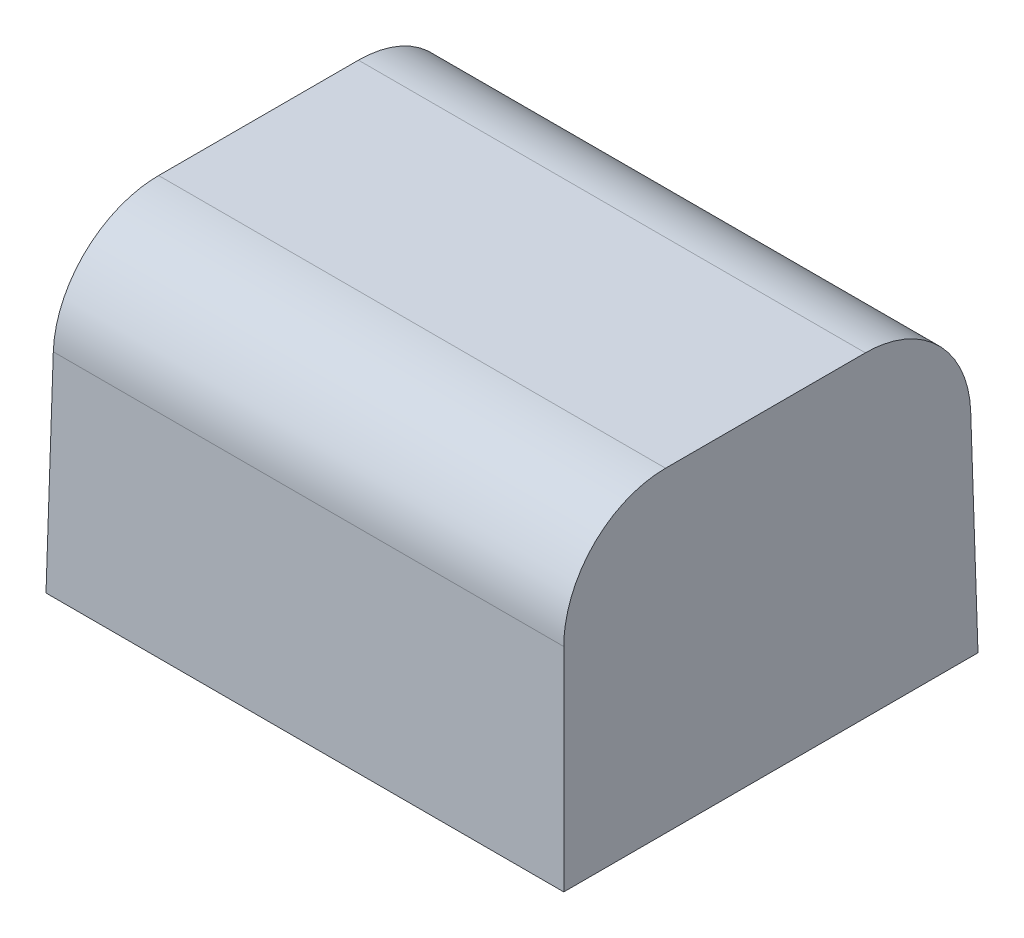
ISO-10303-21;
HEADER;
FILE_DESCRIPTION(('STEP AP214'),'2;1');
FILE_NAME('part.step','',(''),(''),'','','');
FILE_SCHEMA(('AUTOMOTIVE_DESIGN { 1 0 10303 214 1 1 1 1 }'));
ENDSEC;
DATA;
#1=APPLICATION_CONTEXT('core data for automotive mechanical design processes');
#2=APPLICATION_PROTOCOL_DEFINITION('international standard','automotive_design',2000,#1);
#3=PRODUCT_CONTEXT('',#1,'mechanical');
#4=PRODUCT('Part','Part','',(#3));
#5=PRODUCT_RELATED_PRODUCT_CATEGORY('part','',(#4));
#6=PRODUCT_DEFINITION_FORMATION('','',#4);
#7=PRODUCT_DEFINITION_CONTEXT('part definition',#1,'design');
#8=PRODUCT_DEFINITION('design','',#6,#7);
#9=PRODUCT_DEFINITION_SHAPE('','',#8);
#10=(LENGTH_UNIT() NAMED_UNIT(*) SI_UNIT(.MILLI.,.METRE.));
#11=(NAMED_UNIT(*) PLANE_ANGLE_UNIT() SI_UNIT($,.RADIAN.));
#12=(NAMED_UNIT(*) SI_UNIT($,.STERADIAN.) SOLID_ANGLE_UNIT());
#13=UNCERTAINTY_MEASURE_WITH_UNIT(LENGTH_MEASURE(1.E-05),#10,'distance_accuracy_value','');
#14=(GEOMETRIC_REPRESENTATION_CONTEXT(3) GLOBAL_UNCERTAINTY_ASSIGNED_CONTEXT((#13)) GLOBAL_UNIT_ASSIGNED_CONTEXT((#10,
#11,#12)) REPRESENTATION_CONTEXT('',''));
#15=CARTESIAN_POINT('',(0.,0.,0.));
#16=DIRECTION('',(0.,0.,1.));
#17=DIRECTION('',(1.,0.,0.));
#18=AXIS2_PLACEMENT_3D('',#15,#16,#17);
#19=CARTESIAN_POINT('',(0.,0.,-40.));
#20=DIRECTION('',(-0.999847695156391,0.0174524064372835,0.));
#21=DIRECTION('',(-0.0174524064372835,-0.999847695156391,0.));
#22=AXIS2_PLACEMENT_3D('',#19,#20,#21);
#23=PLANE('',#22);
#24=DIRECTION('',(0.,0.,-1.));
#25=VECTOR('',#24,1.);
#26=CARTESIAN_POINT('',(0.523651947846529,30.,-40.));
#27=LINE('',#26,#25);
#28=CARTESIAN_POINT('',(0.523651947846529,30.,-29.6493754209966));
#29=VERTEX_POINT('',#28);
#30=CARTESIAN_POINT('',(0.523651947846529,30.,-10.3506245790034));
#31=VERTEX_POINT('',#30);
#32=EDGE_CURVE('E130',#29,#31,#27,.F.);
#33=ORIENTED_EDGE('',*,*,#32,.F.);
#34=CARTESIAN_POINT('',(0.349101298564352,20.,-29.6493754209966));
#35=DIRECTION('',(-0.999847695156391,0.0174524064372835,0.));
#36=DIRECTION('',(-0.0174524064372835,-0.999847695156391,0.));
#37=AXIS2_PLACEMENT_3D('',#34,#35,#36);
#38=ELLIPSE('',#37,10.0015232804391,10.);
#39=CARTESIAN_POINT('',(0.352147627439517,20.1745240643728,-39.6478523725605));
#40=VERTEX_POINT('',#39);
#41=EDGE_CURVE('E156',#29,#40,#38,.T.);
#42=ORIENTED_EDGE('',*,*,#41,.T.);
#43=DIRECTION('',(-0.0174497491606827,-0.999695459881887,-0.0174497491606827));
#44=VECTOR('',#43,1.);
#45=CARTESIAN_POINT('',(0.,0.,-40.));
#46=LINE('',#45,#44);
#47=CARTESIAN_POINT('',(0.,0.,-40.));
#48=VERTEX_POINT('',#47);
#49=EDGE_CURVE('E121',#40,#48,#46,.T.);
#50=ORIENTED_EDGE('',*,*,#49,.T.);
#51=DIRECTION('',(0.,0.,1.));
#52=VECTOR('',#51,1.);
#53=CARTESIAN_POINT('',(0.,0.,-40.));
#54=LINE('',#53,#52);
#55=CARTESIAN_POINT('',(0.,0.,0.));
#56=VERTEX_POINT('',#55);
#57=EDGE_CURVE('E115',#48,#56,#54,.T.);
#58=ORIENTED_EDGE('',*,*,#57,.T.);
#59=DIRECTION('',(-0.0174497491606827,-0.999695459881887,0.0174497491606827));
#60=VECTOR('',#59,1.);
#61=CARTESIAN_POINT('',(0.,0.,0.));
#62=LINE('',#61,#60);
#63=CARTESIAN_POINT('',(0.352147627439517,20.1745240643728,-0.352147627439517));
#64=VERTEX_POINT('',#63);
#65=EDGE_CURVE('E98',#64,#56,#62,.T.);
#66=ORIENTED_EDGE('',*,*,#65,.F.);
#67=CARTESIAN_POINT('',(0.349101298564352,20.,-10.3506245790034));
#68=DIRECTION('',(-0.999847695156391,0.0174524064372835,0.));
#69=DIRECTION('',(0.0174524064372835,0.999847695156391,0.));
#70=AXIS2_PLACEMENT_3D('',#67,#68,#69);
#71=ELLIPSE('',#70,10.0015232804391,10.);
#72=EDGE_CURVE('E153',#64,#31,#71,.T.);
#73=ORIENTED_EDGE('',*,*,#72,.T.);
#74=EDGE_LOOP('',(#33,#42,#50,#58,#66,#73));
#75=FACE_BOUND('',#74,.T.);
#76=ADVANCED_FACE('F44',(#75),#23,.T.);
#77=CARTESIAN_POINT('',(0.,0.,0.));
#78=DIRECTION('',(0.,0.0174524064372835,0.999847695156391));
#79=DIRECTION('',(0.,-0.999847695156391,0.0174524064372835));
#80=AXIS2_PLACEMENT_3D('',#77,#78,#79);
#81=PLANE('',#80);
#82=DIRECTION('',(0.0174497491606827,-0.999695459881887,0.0174497491606827));
#83=VECTOR('',#82,1.);
#84=CARTESIAN_POINT('',(50.,0.,0.));
#85=LINE('',#84,#83);
#86=CARTESIAN_POINT('',(49.6478523725605,20.1745240643728,-0.352147627439517));
#87=VERTEX_POINT('',#86);
#88=CARTESIAN_POINT('',(50.,0.,0.));
#89=VERTEX_POINT('',#88);
#90=EDGE_CURVE('E109',#87,#89,#85,.T.);
#91=ORIENTED_EDGE('',*,*,#90,.F.);
#92=DIRECTION('',(1.,0.,0.));
#93=VECTOR('',#92,1.);
#94=CARTESIAN_POINT('',(0.523651947846529,20.1745240643728,-0.352147627439517));
#95=LINE('',#94,#93);
#96=EDGE_CURVE('E11',#87,#64,#95,.F.);
#97=ORIENTED_EDGE('',*,*,#96,.T.);
#98=ORIENTED_EDGE('',*,*,#65,.T.);
#99=DIRECTION('',(1.,0.,0.));
#100=VECTOR('',#99,1.);
#101=CARTESIAN_POINT('',(0.,0.,0.));
#102=LINE('',#101,#100);
#103=EDGE_CURVE('E101',#56,#89,#102,.T.);
#104=ORIENTED_EDGE('',*,*,#103,.T.);
#105=EDGE_LOOP('',(#91,#97,#98,#104));
#106=FACE_BOUND('',#105,.T.);
#107=ADVANCED_FACE('F100',(#106),#81,.T.);
#108=CARTESIAN_POINT('',(50.,0.,0.));
#109=DIRECTION('',(0.999847695156391,0.0174524064372835,0.));
#110=DIRECTION('',(-0.0174524064372835,0.999847695156391,0.));
#111=AXIS2_PLACEMENT_3D('',#108,#109,#110);
#112=PLANE('',#111);
#113=DIRECTION('',(0.0174497491606827,-0.999695459881887,-0.0174497491606827));
#114=VECTOR('',#113,1.);
#115=CARTESIAN_POINT('',(50.,0.,-40.));
#116=LINE('',#115,#114);
#117=CARTESIAN_POINT('',(49.6478523725605,20.1745240643728,-39.6478523725605));
#118=VERTEX_POINT('',#117);
#119=CARTESIAN_POINT('',(50.,0.,-40.));
#120=VERTEX_POINT('',#119);
#121=EDGE_CURVE('E134',#118,#120,#116,.T.);
#122=ORIENTED_EDGE('',*,*,#121,.F.);
#123=CARTESIAN_POINT('',(49.6508987014357,20.,-29.6493754209966));
#124=DIRECTION('',(0.999847695156391,0.0174524064372835,0.));
#125=DIRECTION('',(-0.0174524064372835,0.999847695156391,0.));
#126=AXIS2_PLACEMENT_3D('',#123,#124,#125);
#127=ELLIPSE('',#126,10.0015232804391,10.);
#128=CARTESIAN_POINT('',(49.4763480521535,30.,-29.6493754209966));
#129=VERTEX_POINT('',#128);
#130=EDGE_CURVE('E53',#118,#129,#127,.T.);
#131=ORIENTED_EDGE('',*,*,#130,.T.);
#132=DIRECTION('',(0.,0.,1.));
#133=VECTOR('',#132,1.);
#134=CARTESIAN_POINT('',(49.4763480521535,30.,0.));
#135=LINE('',#134,#133);
#136=CARTESIAN_POINT('',(49.4763480521535,30.,-10.3506245790034));
#137=VERTEX_POINT('',#136);
#138=EDGE_CURVE('E135',#137,#129,#135,.F.);
#139=ORIENTED_EDGE('',*,*,#138,.F.);
#140=CARTESIAN_POINT('',(49.6508987014357,20.,-10.3506245790034));
#141=DIRECTION('',(0.999847695156391,0.0174524064372835,0.));
#142=DIRECTION('',(0.0174524064372835,-0.999847695156391,0.));
#143=AXIS2_PLACEMENT_3D('',#140,#141,#142);
#144=ELLIPSE('',#143,10.0015232804391,10.);
#145=EDGE_CURVE('E60',#137,#87,#144,.T.);
#146=ORIENTED_EDGE('',*,*,#145,.T.);
#147=ORIENTED_EDGE('',*,*,#90,.T.);
#148=DIRECTION('',(0.,0.,-1.));
#149=VECTOR('',#148,1.);
#150=CARTESIAN_POINT('',(50.,0.,0.));
#151=LINE('',#150,#149);
#152=EDGE_CURVE('E117',#89,#120,#151,.T.);
#153=ORIENTED_EDGE('',*,*,#152,.T.);
#154=EDGE_LOOP('',(#122,#131,#139,#146,#147,#153));
#155=FACE_BOUND('',#154,.T.);
#156=ADVANCED_FACE('F164',(#155),#112,.T.);
#157=CARTESIAN_POINT('',(50.,0.,-40.));
#158=DIRECTION('',(0.,0.0174524064372835,-0.999847695156391));
#159=DIRECTION('',(0.,0.999847695156391,0.0174524064372835));
#160=AXIS2_PLACEMENT_3D('',#157,#158,#159);
#161=PLANE('',#160);
#162=ORIENTED_EDGE('',*,*,#49,.F.);
#163=DIRECTION('',(-1.,0.,0.));
#164=VECTOR('',#163,1.);
#165=CARTESIAN_POINT('',(49.4763480521535,20.1745240643728,-39.6478523725605));
#166=LINE('',#165,#164);
#167=EDGE_CURVE('E68',#40,#118,#166,.F.);
#168=ORIENTED_EDGE('',*,*,#167,.T.);
#169=ORIENTED_EDGE('',*,*,#121,.T.);
#170=DIRECTION('',(-1.,0.,0.));
#171=VECTOR('',#170,1.);
#172=CARTESIAN_POINT('',(50.,0.,-40.));
#173=LINE('',#172,#171);
#174=EDGE_CURVE('E128',#120,#48,#173,.T.);
#175=ORIENTED_EDGE('',*,*,#174,.T.);
#176=EDGE_LOOP('',(#162,#168,#169,#175));
#177=FACE_BOUND('',#176,.T.);
#178=ADVANCED_FACE('F171',(#177),#161,.T.);
#179=CARTESIAN_POINT('',(0.,30.,0.));
#180=DIRECTION('',(0.,1.,0.));
#181=DIRECTION('',(0.,0.,1.));
#182=AXIS2_PLACEMENT_3D('',#179,#180,#181);
#183=PLANE('',#182);
#184=ORIENTED_EDGE('',*,*,#138,.T.);
#185=DIRECTION('',(1.,0.,0.));
#186=VECTOR('',#185,1.);
#187=CARTESIAN_POINT('',(0.52365194784653,30.,-29.6493754209966));
#188=LINE('',#187,#186);
#189=EDGE_CURVE('E149',#129,#29,#188,.F.);
#190=ORIENTED_EDGE('',*,*,#189,.T.);
#191=ORIENTED_EDGE('',*,*,#32,.T.);
#192=DIRECTION('',(-1.,0.,0.));
#193=VECTOR('',#192,1.);
#194=CARTESIAN_POINT('',(49.4763480521535,30.,-10.3506245790034));
#195=LINE('',#194,#193);
#196=EDGE_CURVE('E108',#31,#137,#195,.F.);
#197=ORIENTED_EDGE('',*,*,#196,.T.);
#198=EDGE_LOOP('',(#184,#190,#191,#197));
#199=FACE_BOUND('',#198,.T.);
#200=ADVANCED_FACE('F168',(#199),#183,.T.);
#201=CARTESIAN_POINT('',(0.,0.,0.));
#202=DIRECTION('',(0.,1.,0.));
#203=DIRECTION('',(0.,0.,1.));
#204=AXIS2_PLACEMENT_3D('',#201,#202,#203);
#205=PLANE('',#204);
#206=ORIENTED_EDGE('',*,*,#57,.F.);
#207=ORIENTED_EDGE('',*,*,#174,.F.);
#208=ORIENTED_EDGE('',*,*,#152,.F.);
#209=ORIENTED_EDGE('',*,*,#103,.F.);
#210=EDGE_LOOP('',(#206,#207,#208,#209));
#211=FACE_BOUND('',#210,.T.);
#212=ADVANCED_FACE('F113',(#211),#205,.F.);
#213=CARTESIAN_POINT('',(0.,20.,-29.6493754209966));
#214=DIRECTION('',(-1.,0.,0.));
#215=DIRECTION('',(0.,0.,1.));
#216=AXIS2_PLACEMENT_3D('',#213,#214,#215);
#217=CYLINDRICAL_SURFACE('',#216,10.);
#218=ORIENTED_EDGE('',*,*,#130,.F.);
#219=ORIENTED_EDGE('',*,*,#167,.F.);
#220=ORIENTED_EDGE('',*,*,#41,.F.);
#221=ORIENTED_EDGE('',*,*,#189,.F.);
#222=EDGE_LOOP('',(#218,#219,#220,#221));
#223=FACE_BOUND('',#222,.T.);
#224=ADVANCED_FACE('F170',(#223),#217,.T.);
#225=CARTESIAN_POINT('',(0.,20.,-10.3506245790034));
#226=DIRECTION('',(1.,0.,0.));
#227=DIRECTION('',(0.,0.,-1.));
#228=AXIS2_PLACEMENT_3D('',#225,#226,#227);
#229=CYLINDRICAL_SURFACE('',#228,10.);
#230=ORIENTED_EDGE('',*,*,#72,.F.);
#231=ORIENTED_EDGE('',*,*,#96,.F.);
#232=ORIENTED_EDGE('',*,*,#145,.F.);
#233=ORIENTED_EDGE('',*,*,#196,.F.);
#234=EDGE_LOOP('',(#230,#231,#232,#233));
#235=FACE_BOUND('',#234,.T.);
#236=ADVANCED_FACE('F46',(#235),#229,.T.);
#237=CLOSED_SHELL('',(#76,#107,#156,#178,#200,#212,#224,#236));
#238=MANIFOLD_SOLID_BREP('B2',#237);
#239=ADVANCED_BREP_SHAPE_REPRESENTATION('',(#18,#238),#14);
#240=SHAPE_DEFINITION_REPRESENTATION(#9,#239);
ENDSEC;
END-ISO-10303-21;
